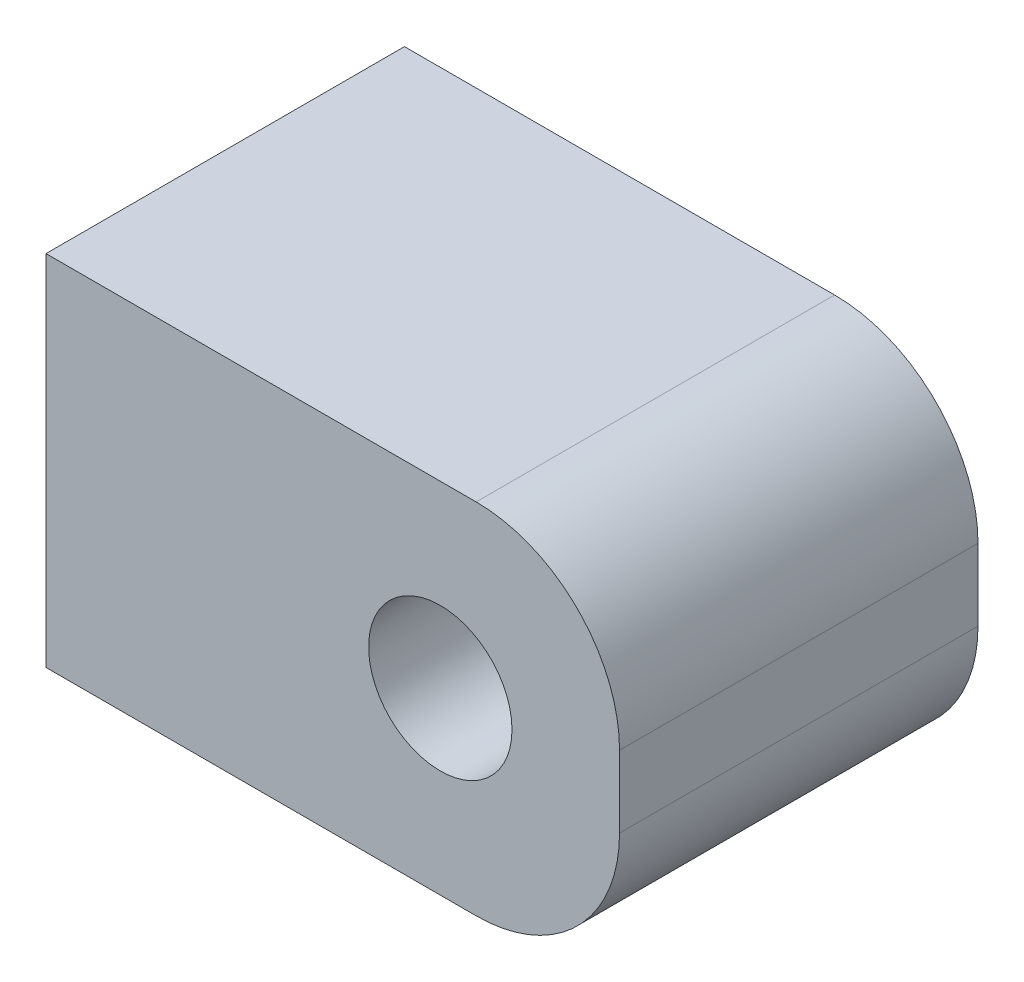
ISO-10303-21;
HEADER;
FILE_DESCRIPTION(('STEP AP214'),'2;1');
FILE_NAME('part.step','',(''),(''),'','','');
FILE_SCHEMA(('AUTOMOTIVE_DESIGN { 1 0 10303 214 1 1 1 1 }'));
ENDSEC;
DATA;
#1=APPLICATION_CONTEXT('core data for automotive mechanical design processes');
#2=APPLICATION_PROTOCOL_DEFINITION('international standard','automotive_design',2000,#1);
#3=PRODUCT_CONTEXT('',#1,'mechanical');
#4=PRODUCT('Part','Part','',(#3));
#5=PRODUCT_RELATED_PRODUCT_CATEGORY('part','',(#4));
#6=PRODUCT_DEFINITION_FORMATION('','',#4);
#7=PRODUCT_DEFINITION_CONTEXT('part definition',#1,'design');
#8=PRODUCT_DEFINITION('design','',#6,#7);
#9=PRODUCT_DEFINITION_SHAPE('','',#8);
#10=(LENGTH_UNIT() NAMED_UNIT(*) SI_UNIT(.MILLI.,.METRE.));
#11=(NAMED_UNIT(*) PLANE_ANGLE_UNIT() SI_UNIT($,.RADIAN.));
#12=(NAMED_UNIT(*) SI_UNIT($,.STERADIAN.) SOLID_ANGLE_UNIT());
#13=UNCERTAINTY_MEASURE_WITH_UNIT(LENGTH_MEASURE(1.E-05),#10,'distance_accuracy_value','');
#14=(GEOMETRIC_REPRESENTATION_CONTEXT(3) GLOBAL_UNCERTAINTY_ASSIGNED_CONTEXT((#13)) GLOBAL_UNIT_ASSIGNED_CONTEXT((#10,
#11,#12)) REPRESENTATION_CONTEXT('',''));
#15=CARTESIAN_POINT('',(0.,0.,0.));
#16=DIRECTION('',(0.,0.,1.));
#17=DIRECTION('',(1.,0.,0.));
#18=AXIS2_PLACEMENT_3D('',#15,#16,#17);
#19=CARTESIAN_POINT('',(0.,0.,5.));
#20=DIRECTION('',(1.,0.,0.));
#21=DIRECTION('',(0.,0.,-1.));
#22=AXIS2_PLACEMENT_3D('',#19,#20,#21);
#23=PLANE('',#22);
#24=CARTESIAN_POINT('',(0.,2.5,2.5));
#25=DIRECTION('',(-1.,0.,0.));
#26=DIRECTION('',(0.,0.,1.));
#27=AXIS2_PLACEMENT_3D('',#24,#25,#26);
#28=CIRCLE('',#27,1.);
#29=CARTESIAN_POINT('',(0.,2.5,3.5));
#30=VERTEX_POINT('',#29);
#31=EDGE_CURVE('E220',#30,#30,#28,.T.);
#32=ORIENTED_EDGE('',*,*,#31,.F.);
#33=EDGE_LOOP('',(#32));
#34=FACE_BOUND('',#33,.T.);
#35=DIRECTION('',(0.,-1.,0.));
#36=VECTOR('',#35,1.);
#37=CARTESIAN_POINT('',(0.,0.,0.));
#38=LINE('',#37,#36);
#39=CARTESIAN_POINT('',(0.,5.,0.));
#40=VERTEX_POINT('',#39);
#41=CARTESIAN_POINT('',(0.,0.,0.));
#42=VERTEX_POINT('',#41);
#43=EDGE_CURVE('E120',#40,#42,#38,.T.);
#44=ORIENTED_EDGE('',*,*,#43,.T.);
#45=DIRECTION('',(0.,0.,-1.));
#46=VECTOR('',#45,1.);
#47=CARTESIAN_POINT('',(0.,0.,5.));
#48=LINE('',#47,#46);
#49=CARTESIAN_POINT('',(0.,0.,5.));
#50=VERTEX_POINT('',#49);
#51=EDGE_CURVE('E103',#50,#42,#48,.T.);
#52=ORIENTED_EDGE('',*,*,#51,.F.);
#53=DIRECTION('',(0.,-1.,0.));
#54=VECTOR('',#53,1.);
#55=CARTESIAN_POINT('',(0.,0.,5.));
#56=LINE('',#55,#54);
#57=CARTESIAN_POINT('',(0.,5.,5.));
#58=VERTEX_POINT('',#57);
#59=EDGE_CURVE('E108',#58,#50,#56,.T.);
#60=ORIENTED_EDGE('',*,*,#59,.F.);
#61=DIRECTION('',(0.,0.,-1.));
#62=VECTOR('',#61,1.);
#63=CARTESIAN_POINT('',(0.,5.,5.));
#64=LINE('',#63,#62);
#65=EDGE_CURVE('E123',#58,#40,#64,.T.);
#66=ORIENTED_EDGE('',*,*,#65,.T.);
#67=EDGE_LOOP('',(#44,#52,#60,#66));
#68=FACE_BOUND('',#67,.T.);
#69=ADVANCED_FACE('F45',(#34,#68),#23,.F.);
#70=CARTESIAN_POINT('',(0.,0.,5.));
#71=DIRECTION('',(0.,1.,0.));
#72=DIRECTION('',(0.,0.,1.));
#73=AXIS2_PLACEMENT_3D('',#70,#71,#72);
#74=PLANE('',#73);
#75=DIRECTION('',(1.,0.,0.));
#76=VECTOR('',#75,1.);
#77=CARTESIAN_POINT('',(0.,0.,0.));
#78=LINE('',#77,#76);
#79=CARTESIAN_POINT('',(6.,0.,0.));
#80=VERTEX_POINT('',#79);
#81=EDGE_CURVE('E158',#42,#80,#78,.T.);
#82=ORIENTED_EDGE('',*,*,#81,.T.);
#83=DIRECTION('',(0.,0.,-1.));
#84=VECTOR('',#83,1.);
#85=CARTESIAN_POINT('',(6.,0.,5.));
#86=LINE('',#85,#84);
#87=CARTESIAN_POINT('',(6.,0.,5.));
#88=VERTEX_POINT('',#87);
#89=EDGE_CURVE('E69',#80,#88,#86,.F.);
#90=ORIENTED_EDGE('',*,*,#89,.T.);
#91=DIRECTION('',(1.,0.,0.));
#92=VECTOR('',#91,1.);
#93=CARTESIAN_POINT('',(0.,0.,5.));
#94=LINE('',#93,#92);
#95=EDGE_CURVE('E99',#50,#88,#94,.T.);
#96=ORIENTED_EDGE('',*,*,#95,.F.);
#97=ORIENTED_EDGE('',*,*,#51,.T.);
#98=EDGE_LOOP('',(#82,#90,#96,#97));
#99=FACE_BOUND('',#98,.T.);
#100=ADVANCED_FACE('F101',(#99),#74,.F.);
#101=CARTESIAN_POINT('',(8.,0.,5.));
#102=DIRECTION('',(-1.,0.,0.));
#103=DIRECTION('',(0.,0.,1.));
#104=AXIS2_PLACEMENT_3D('',#101,#102,#103);
#105=PLANE('',#104);
#106=DIRECTION('',(0.,1.,0.));
#107=VECTOR('',#106,1.);
#108=CARTESIAN_POINT('',(8.,0.,5.));
#109=LINE('',#108,#107);
#110=CARTESIAN_POINT('',(8.,2.,5.));
#111=VERTEX_POINT('',#110);
#112=CARTESIAN_POINT('',(8.,3.,5.));
#113=VERTEX_POINT('',#112);
#114=EDGE_CURVE('E107',#111,#113,#109,.T.);
#115=ORIENTED_EDGE('',*,*,#114,.F.);
#116=DIRECTION('',(0.,0.,-1.));
#117=VECTOR('',#116,1.);
#118=CARTESIAN_POINT('',(8.,2.,5.));
#119=LINE('',#118,#117);
#120=CARTESIAN_POINT('',(8.,2.,0.));
#121=VERTEX_POINT('',#120);
#122=EDGE_CURVE('E127',#111,#121,#119,.T.);
#123=ORIENTED_EDGE('',*,*,#122,.T.);
#124=DIRECTION('',(0.,1.,0.));
#125=VECTOR('',#124,1.);
#126=CARTESIAN_POINT('',(8.,0.,0.));
#127=LINE('',#126,#125);
#128=CARTESIAN_POINT('',(8.,3.,0.));
#129=VERTEX_POINT('',#128);
#130=EDGE_CURVE('E159',#121,#129,#127,.T.);
#131=ORIENTED_EDGE('',*,*,#130,.T.);
#132=DIRECTION('',(0.,0.,-1.));
#133=VECTOR('',#132,1.);
#134=CARTESIAN_POINT('',(8.,3.,5.));
#135=LINE('',#134,#133);
#136=EDGE_CURVE('E122',#129,#113,#135,.F.);
#137=ORIENTED_EDGE('',*,*,#136,.T.);
#138=EDGE_LOOP('',(#115,#123,#131,#137));
#139=FACE_BOUND('',#138,.T.);
#140=ADVANCED_FACE('F149',(#139),#105,.F.);
#141=CARTESIAN_POINT('',(0.,5.,5.));
#142=DIRECTION('',(0.,-1.,0.));
#143=DIRECTION('',(0.,0.,-1.));
#144=AXIS2_PLACEMENT_3D('',#141,#142,#143);
#145=PLANE('',#144);
#146=DIRECTION('',(-1.,0.,0.));
#147=VECTOR('',#146,1.);
#148=CARTESIAN_POINT('',(0.,5.,5.));
#149=LINE('',#148,#147);
#150=CARTESIAN_POINT('',(6.,5.,5.));
#151=VERTEX_POINT('',#150);
#152=EDGE_CURVE('E112',#151,#58,#149,.T.);
#153=ORIENTED_EDGE('',*,*,#152,.F.);
#154=DIRECTION('',(0.,0.,-1.));
#155=VECTOR('',#154,1.);
#156=CARTESIAN_POINT('',(6.,5.,5.));
#157=LINE('',#156,#155);
#158=CARTESIAN_POINT('',(6.,5.,0.));
#159=VERTEX_POINT('',#158);
#160=EDGE_CURVE('E11',#151,#159,#157,.T.);
#161=ORIENTED_EDGE('',*,*,#160,.T.);
#162=DIRECTION('',(-1.,0.,0.));
#163=VECTOR('',#162,1.);
#164=CARTESIAN_POINT('',(0.,5.,0.));
#165=LINE('',#164,#163);
#166=EDGE_CURVE('E117',#159,#40,#165,.T.);
#167=ORIENTED_EDGE('',*,*,#166,.T.);
#168=ORIENTED_EDGE('',*,*,#65,.F.);
#169=EDGE_LOOP('',(#153,#161,#167,#168));
#170=FACE_BOUND('',#169,.T.);
#171=ADVANCED_FACE('F171',(#170),#145,.F.);
#172=CARTESIAN_POINT('',(0.,0.,5.));
#173=DIRECTION('',(0.,0.,-1.));
#174=DIRECTION('',(-1.,0.,0.));
#175=AXIS2_PLACEMENT_3D('',#172,#173,#174);
#176=PLANE('',#175);
#177=CARTESIAN_POINT('',(5.5,2.5,5.));
#178=DIRECTION('',(0.,0.,1.));
#179=DIRECTION('',(1.,0.,0.));
#180=AXIS2_PLACEMENT_3D('',#177,#178,#179);
#181=CIRCLE('',#180,1.);
#182=CARTESIAN_POINT('',(6.5,2.5,5.));
#183=VERTEX_POINT('',#182);
#184=EDGE_CURVE('E216',#183,#183,#181,.T.);
#185=ORIENTED_EDGE('',*,*,#184,.F.);
#186=EDGE_LOOP('',(#185));
#187=FACE_BOUND('',#186,.T.);
#188=ORIENTED_EDGE('',*,*,#95,.T.);
#189=CARTESIAN_POINT('',(6.,2.,5.));
#190=DIRECTION('',(0.,0.,-1.));
#191=DIRECTION('',(-1.,0.,0.));
#192=AXIS2_PLACEMENT_3D('',#189,#190,#191);
#193=CIRCLE('',#192,2.);
#194=EDGE_CURVE('E54',#88,#111,#193,.F.);
#195=ORIENTED_EDGE('',*,*,#194,.T.);
#196=ORIENTED_EDGE('',*,*,#114,.T.);
#197=CARTESIAN_POINT('',(6.,3.,5.));
#198=DIRECTION('',(0.,0.,-1.));
#199=DIRECTION('',(-1.,0.,0.));
#200=AXIS2_PLACEMENT_3D('',#197,#198,#199);
#201=CIRCLE('',#200,2.);
#202=EDGE_CURVE('E61',#113,#151,#201,.F.);
#203=ORIENTED_EDGE('',*,*,#202,.T.);
#204=ORIENTED_EDGE('',*,*,#152,.T.);
#205=ORIENTED_EDGE('',*,*,#59,.T.);
#206=EDGE_LOOP('',(#188,#195,#196,#203,#204,#205));
#207=FACE_BOUND('',#206,.T.);
#208=ADVANCED_FACE('F111',(#187,#207),#176,.F.);
#209=CARTESIAN_POINT('',(0.,0.,0.));
#210=DIRECTION('',(0.,0.,-1.));
#211=DIRECTION('',(-1.,0.,0.));
#212=AXIS2_PLACEMENT_3D('',#209,#210,#211);
#213=PLANE('',#212);
#214=CARTESIAN_POINT('',(5.5,2.5,0.));
#215=DIRECTION('',(0.,0.,1.));
#216=DIRECTION('',(1.,0.,0.));
#217=AXIS2_PLACEMENT_3D('',#214,#215,#216);
#218=CIRCLE('',#217,1.);
#219=CARTESIAN_POINT('',(6.5,2.5,0.));
#220=VERTEX_POINT('',#219);
#221=EDGE_CURVE('E213',#220,#220,#218,.T.);
#222=ORIENTED_EDGE('',*,*,#221,.T.);
#223=EDGE_LOOP('',(#222));
#224=FACE_BOUND('',#223,.T.);
#225=ORIENTED_EDGE('',*,*,#130,.F.);
#226=CARTESIAN_POINT('',(6.,2.,0.));
#227=DIRECTION('',(0.,0.,-1.));
#228=DIRECTION('',(-1.,0.,0.));
#229=AXIS2_PLACEMENT_3D('',#226,#227,#228);
#230=CIRCLE('',#229,2.);
#231=EDGE_CURVE('E138',#121,#80,#230,.T.);
#232=ORIENTED_EDGE('',*,*,#231,.T.);
#233=ORIENTED_EDGE('',*,*,#81,.F.);
#234=ORIENTED_EDGE('',*,*,#43,.F.);
#235=ORIENTED_EDGE('',*,*,#166,.F.);
#236=CARTESIAN_POINT('',(6.,3.,0.));
#237=DIRECTION('',(0.,0.,-1.));
#238=DIRECTION('',(-1.,0.,0.));
#239=AXIS2_PLACEMENT_3D('',#236,#237,#238);
#240=CIRCLE('',#239,2.);
#241=EDGE_CURVE('E135',#159,#129,#240,.T.);
#242=ORIENTED_EDGE('',*,*,#241,.T.);
#243=EDGE_LOOP('',(#225,#232,#233,#234,#235,#242));
#244=FACE_BOUND('',#243,.T.);
#245=ADVANCED_FACE('F157',(#224,#244),#213,.T.);
#246=CARTESIAN_POINT('',(4.,2.5,2.5));
#247=DIRECTION('',(-1.,0.,0.));
#248=DIRECTION('',(0.,0.,1.));
#249=AXIS2_PLACEMENT_3D('',#246,#247,#248);
#250=CYLINDRICAL_SURFACE('',#249,1.);
#251=CARTESIAN_POINT('',(4.,2.5,2.5));
#252=DIRECTION('',(-1.,0.,0.));
#253=DIRECTION('',(0.,0.,1.));
#254=AXIS2_PLACEMENT_3D('',#251,#252,#253);
#255=CIRCLE('',#254,1.);
#256=CARTESIAN_POINT('',(4.,2.5,3.5));
#257=VERTEX_POINT('',#256);
#258=EDGE_CURVE('E165',#257,#257,#255,.T.);
#259=ORIENTED_EDGE('',*,*,#258,.F.);
#260=EDGE_LOOP('',(#259));
#261=FACE_BOUND('',#260,.T.);
#262=ORIENTED_EDGE('',*,*,#31,.T.);
#263=EDGE_LOOP('',(#262));
#264=FACE_BOUND('',#263,.T.);
#265=ADVANCED_FACE('F195',(#261,#264),#250,.F.);
#266=CARTESIAN_POINT('',(4.,2.5,2.5));
#267=DIRECTION('',(-1.,0.,0.));
#268=DIRECTION('',(0.,0.,1.));
#269=AXIS2_PLACEMENT_3D('',#266,#267,#268);
#270=PLANE('',#269);
#271=ORIENTED_EDGE('',*,*,#258,.T.);
#272=EDGE_LOOP('',(#271));
#273=FACE_BOUND('',#272,.T.);
#274=ADVANCED_FACE('F201',(#273),#270,.T.);
#275=CARTESIAN_POINT('',(5.5,2.5,0.));
#276=DIRECTION('',(0.,0.,1.));
#277=DIRECTION('',(1.,0.,0.));
#278=AXIS2_PLACEMENT_3D('',#275,#276,#277);
#279=CYLINDRICAL_SURFACE('',#278,1.);
#280=ORIENTED_EDGE('',*,*,#221,.F.);
#281=EDGE_LOOP('',(#280));
#282=FACE_BOUND('',#281,.T.);
#283=ORIENTED_EDGE('',*,*,#184,.T.);
#284=EDGE_LOOP('',(#283));
#285=FACE_BOUND('',#284,.T.);
#286=ADVANCED_FACE('F178',(#282,#285),#279,.F.);
#287=CARTESIAN_POINT('',(6.,2.,5.));
#288=DIRECTION('',(0.,0.,-1.));
#289=DIRECTION('',(-1.,0.,0.));
#290=AXIS2_PLACEMENT_3D('',#287,#288,#289);
#291=CYLINDRICAL_SURFACE('',#290,2.);
#292=ORIENTED_EDGE('',*,*,#194,.F.);
#293=ORIENTED_EDGE('',*,*,#89,.F.);
#294=ORIENTED_EDGE('',*,*,#231,.F.);
#295=ORIENTED_EDGE('',*,*,#122,.F.);
#296=EDGE_LOOP('',(#292,#293,#294,#295));
#297=FACE_BOUND('',#296,.T.);
#298=ADVANCED_FACE('F155',(#297),#291,.T.);
#299=CARTESIAN_POINT('',(6.,3.,5.));
#300=DIRECTION('',(0.,0.,-1.));
#301=DIRECTION('',(-1.,0.,0.));
#302=AXIS2_PLACEMENT_3D('',#299,#300,#301);
#303=CYLINDRICAL_SURFACE('',#302,2.);
#304=ORIENTED_EDGE('',*,*,#202,.F.);
#305=ORIENTED_EDGE('',*,*,#136,.F.);
#306=ORIENTED_EDGE('',*,*,#241,.F.);
#307=ORIENTED_EDGE('',*,*,#160,.F.);
#308=EDGE_LOOP('',(#304,#305,#306,#307));
#309=FACE_BOUND('',#308,.T.);
#310=ADVANCED_FACE('F47',(#309),#303,.T.);
#311=CLOSED_SHELL('',(#69,#100,#140,#171,#208,#245,#265,#274,#286,#298,#310));
#312=MANIFOLD_SOLID_BREP('B2',#311);
#313=ADVANCED_BREP_SHAPE_REPRESENTATION('',(#18,#312),#14);
#314=SHAPE_DEFINITION_REPRESENTATION(#9,#313);
ENDSEC;
END-ISO-10303-21;
